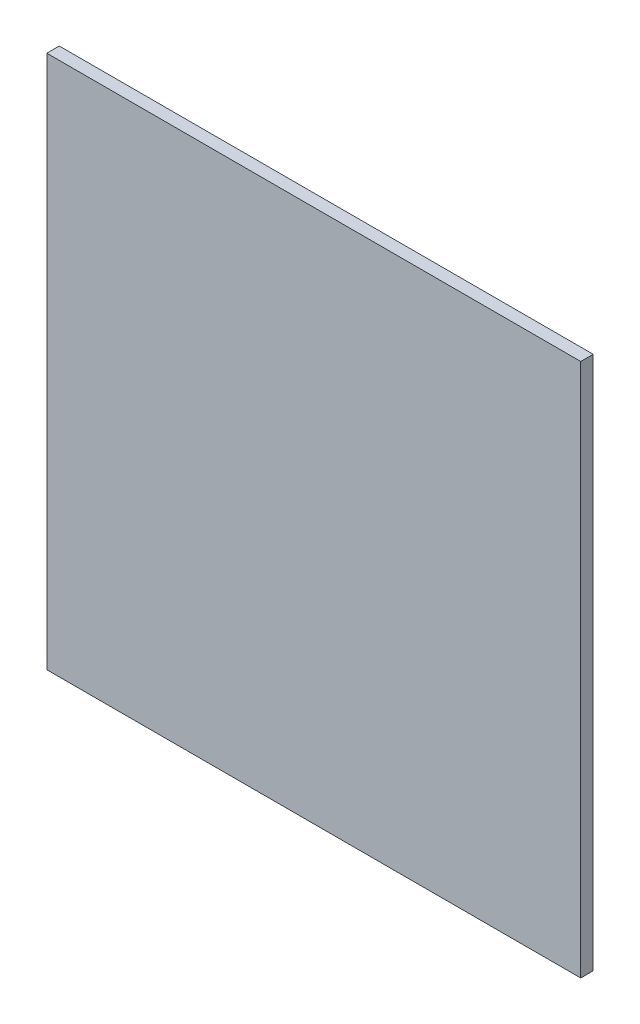
ISO-10303-21;
HEADER;
FILE_DESCRIPTION(('STEP AP214'),'2;1');
FILE_NAME('part.step','',(''),(''),'','','');
FILE_SCHEMA(('AUTOMOTIVE_DESIGN { 1 0 10303 214 1 1 1 1 }'));
ENDSEC;
DATA;
#1=APPLICATION_CONTEXT('core data for automotive mechanical design processes');
#2=APPLICATION_PROTOCOL_DEFINITION('international standard','automotive_design',2000,#1);
#3=PRODUCT_CONTEXT('',#1,'mechanical');
#4=PRODUCT('Part','Part','',(#3));
#5=PRODUCT_RELATED_PRODUCT_CATEGORY('part','',(#4));
#6=PRODUCT_DEFINITION_FORMATION('','',#4);
#7=PRODUCT_DEFINITION_CONTEXT('part definition',#1,'design');
#8=PRODUCT_DEFINITION('design','',#6,#7);
#9=PRODUCT_DEFINITION_SHAPE('','',#8);
#10=(LENGTH_UNIT() NAMED_UNIT(*) SI_UNIT(.MILLI.,.METRE.));
#11=(NAMED_UNIT(*) PLANE_ANGLE_UNIT() SI_UNIT($,.RADIAN.));
#12=(NAMED_UNIT(*) SI_UNIT($,.STERADIAN.) SOLID_ANGLE_UNIT());
#13=UNCERTAINTY_MEASURE_WITH_UNIT(LENGTH_MEASURE(1.E-05),#10,'distance_accuracy_value','');
#14=(GEOMETRIC_REPRESENTATION_CONTEXT(3) GLOBAL_UNCERTAINTY_ASSIGNED_CONTEXT((#13)) GLOBAL_UNIT_ASSIGNED_CONTEXT((#10,
#11,#12)) REPRESENTATION_CONTEXT('',''));
#15=CARTESIAN_POINT('',(0.,0.,0.));
#16=DIRECTION('',(0.,0.,1.));
#17=DIRECTION('',(1.,0.,0.));
#18=AXIS2_PLACEMENT_3D('',#15,#16,#17);
#19=CARTESIAN_POINT('',(88.05,-120.03,1.635));
#20=DIRECTION('',(0.,0.,-1.));
#21=DIRECTION('',(0.,-1.,0.));
#22=AXIS2_PLACEMENT_3D('',#19,#20,#21);
#23=PLANE('',#22);
#24=DIRECTION('',(0.,-1.,0.));
#25=VECTOR('',#24,1.);
#26=CARTESIAN_POINT('',(88.8,-119.28,1.635));
#27=LINE('',#26,#25);
#28=CARTESIAN_POINT('',(88.8,-119.28,1.635));
#29=VERTEX_POINT('',#28);
#30=CARTESIAN_POINT('',(88.8,-120.78,1.635));
#31=VERTEX_POINT('',#30);
#32=EDGE_CURVE('E25',#29,#31,#27,.T.);
#33=ORIENTED_EDGE('',*,*,#32,.F.);
#34=DIRECTION('',(1.,0.,0.));
#35=VECTOR('',#34,1.);
#36=CARTESIAN_POINT('',(87.3,-119.28,1.635));
#37=LINE('',#36,#35);
#38=CARTESIAN_POINT('',(87.3,-119.28,1.635));
#39=VERTEX_POINT('',#38);
#40=EDGE_CURVE('E110',#39,#29,#37,.T.);
#41=ORIENTED_EDGE('',*,*,#40,.F.);
#42=DIRECTION('',(0.,1.,0.));
#43=VECTOR('',#42,1.);
#44=CARTESIAN_POINT('',(87.3,-120.78,1.635));
#45=LINE('',#44,#43);
#46=CARTESIAN_POINT('',(87.3,-120.78,1.635));
#47=VERTEX_POINT('',#46);
#48=EDGE_CURVE('E83',#47,#39,#45,.T.);
#49=ORIENTED_EDGE('',*,*,#48,.F.);
#50=DIRECTION('',(-1.,0.,0.));
#51=VECTOR('',#50,1.);
#52=CARTESIAN_POINT('',(88.8,-120.78,1.635));
#53=LINE('',#52,#51);
#54=EDGE_CURVE('E87',#31,#47,#53,.T.);
#55=ORIENTED_EDGE('',*,*,#54,.F.);
#56=EDGE_LOOP('',(#33,#41,#49,#55));
#57=FACE_BOUND('',#56,.T.);
#58=ADVANCED_FACE('F17',(#57),#23,.F.);
#59=CARTESIAN_POINT('',(88.05,-120.03,1.6));
#60=DIRECTION('',(0.,0.,-1.));
#61=DIRECTION('',(0.,-1.,0.));
#62=AXIS2_PLACEMENT_3D('',#59,#60,#61);
#63=PLANE('',#62);
#64=DIRECTION('',(-1.,0.,0.));
#65=VECTOR('',#64,1.);
#66=CARTESIAN_POINT('',(88.8,-120.78,1.6));
#67=LINE('',#66,#65);
#68=CARTESIAN_POINT('',(88.8,-120.78,1.6));
#69=VERTEX_POINT('',#68);
#70=CARTESIAN_POINT('',(87.3,-120.78,1.6));
#71=VERTEX_POINT('',#70);
#72=EDGE_CURVE('E71',#69,#71,#67,.T.);
#73=ORIENTED_EDGE('',*,*,#72,.T.);
#74=DIRECTION('',(0.,1.,0.));
#75=VECTOR('',#74,1.);
#76=CARTESIAN_POINT('',(87.3,-120.78,1.6));
#77=LINE('',#76,#75);
#78=CARTESIAN_POINT('',(87.3,-119.28,1.6));
#79=VERTEX_POINT('',#78);
#80=EDGE_CURVE('E106',#71,#79,#77,.T.);
#81=ORIENTED_EDGE('',*,*,#80,.T.);
#82=DIRECTION('',(1.,0.,0.));
#83=VECTOR('',#82,1.);
#84=CARTESIAN_POINT('',(87.3,-119.28,1.6));
#85=LINE('',#84,#83);
#86=CARTESIAN_POINT('',(88.8,-119.28,1.6));
#87=VERTEX_POINT('',#86);
#88=EDGE_CURVE('E73',#79,#87,#85,.T.);
#89=ORIENTED_EDGE('',*,*,#88,.T.);
#90=DIRECTION('',(0.,-1.,0.));
#91=VECTOR('',#90,1.);
#92=CARTESIAN_POINT('',(88.8,-119.28,1.6));
#93=LINE('',#92,#91);
#94=EDGE_CURVE('E11',#87,#69,#93,.T.);
#95=ORIENTED_EDGE('',*,*,#94,.T.);
#96=EDGE_LOOP('',(#73,#81,#89,#95));
#97=FACE_BOUND('',#96,.T.);
#98=ADVANCED_FACE('F69',(#97),#63,.T.);
#99=CARTESIAN_POINT('',(88.8,-119.28,1.6));
#100=DIRECTION('',(1.,0.,0.));
#101=DIRECTION('',(0.,1.,0.));
#102=AXIS2_PLACEMENT_3D('',#99,#100,#101);
#103=PLANE('',#102);
#104=DIRECTION('',(0.,0.,1.));
#105=VECTOR('',#104,1.);
#106=CARTESIAN_POINT('',(88.8,-119.28,1.6));
#107=LINE('',#106,#105);
#108=EDGE_CURVE('E107',#87,#29,#107,.T.);
#109=ORIENTED_EDGE('',*,*,#108,.T.);
#110=ORIENTED_EDGE('',*,*,#32,.T.);
#111=DIRECTION('',(0.,0.,1.));
#112=VECTOR('',#111,1.);
#113=CARTESIAN_POINT('',(88.8,-120.78,1.6));
#114=LINE('',#113,#112);
#115=EDGE_CURVE('E79',#69,#31,#114,.T.);
#116=ORIENTED_EDGE('',*,*,#115,.F.);
#117=ORIENTED_EDGE('',*,*,#94,.F.);
#118=EDGE_LOOP('',(#109,#110,#116,#117));
#119=FACE_BOUND('',#118,.T.);
#120=ADVANCED_FACE('F85',(#119),#103,.T.);
#121=CARTESIAN_POINT('',(87.3,-119.28,1.6));
#122=DIRECTION('',(0.,1.,0.));
#123=DIRECTION('',(1.,0.,0.));
#124=AXIS2_PLACEMENT_3D('',#121,#122,#123);
#125=PLANE('',#124);
#126=DIRECTION('',(0.,0.,1.));
#127=VECTOR('',#126,1.);
#128=CARTESIAN_POINT('',(87.3,-119.28,1.6));
#129=LINE('',#128,#127);
#130=EDGE_CURVE('E102',#79,#39,#129,.T.);
#131=ORIENTED_EDGE('',*,*,#130,.T.);
#132=ORIENTED_EDGE('',*,*,#40,.T.);
#133=ORIENTED_EDGE('',*,*,#108,.F.);
#134=ORIENTED_EDGE('',*,*,#88,.F.);
#135=EDGE_LOOP('',(#131,#132,#133,#134));
#136=FACE_BOUND('',#135,.T.);
#137=ADVANCED_FACE('F169',(#136),#125,.T.);
#138=CARTESIAN_POINT('',(87.3,-120.78,1.6));
#139=DIRECTION('',(-1.,0.,0.));
#140=DIRECTION('',(0.,0.,1.));
#141=AXIS2_PLACEMENT_3D('',#138,#139,#140);
#142=PLANE('',#141);
#143=DIRECTION('',(0.,0.,1.));
#144=VECTOR('',#143,1.);
#145=CARTESIAN_POINT('',(87.3,-120.78,1.6));
#146=LINE('',#145,#144);
#147=EDGE_CURVE('E81',#71,#47,#146,.T.);
#148=ORIENTED_EDGE('',*,*,#147,.T.);
#149=ORIENTED_EDGE('',*,*,#48,.T.);
#150=ORIENTED_EDGE('',*,*,#130,.F.);
#151=ORIENTED_EDGE('',*,*,#80,.F.);
#152=EDGE_LOOP('',(#148,#149,#150,#151));
#153=FACE_BOUND('',#152,.T.);
#154=ADVANCED_FACE('F159',(#153),#142,.T.);
#155=CARTESIAN_POINT('',(88.8,-120.78,1.6));
#156=DIRECTION('',(0.,-1.,0.));
#157=DIRECTION('',(0.,0.,-1.));
#158=AXIS2_PLACEMENT_3D('',#155,#156,#157);
#159=PLANE('',#158);
#160=ORIENTED_EDGE('',*,*,#115,.T.);
#161=ORIENTED_EDGE('',*,*,#54,.T.);
#162=ORIENTED_EDGE('',*,*,#147,.F.);
#163=ORIENTED_EDGE('',*,*,#72,.F.);
#164=EDGE_LOOP('',(#160,#161,#162,#163));
#165=FACE_BOUND('',#164,.T.);
#166=ADVANCED_FACE('F77',(#165),#159,.T.);
#167=CLOSED_SHELL('',(#58,#98,#120,#137,#154,#166));
#168=MANIFOLD_SOLID_BREP('B1',#167);
#169=ADVANCED_BREP_SHAPE_REPRESENTATION('',(#18,#168),#14);
#170=SHAPE_DEFINITION_REPRESENTATION(#9,#169);
ENDSEC;
END-ISO-10303-21;
